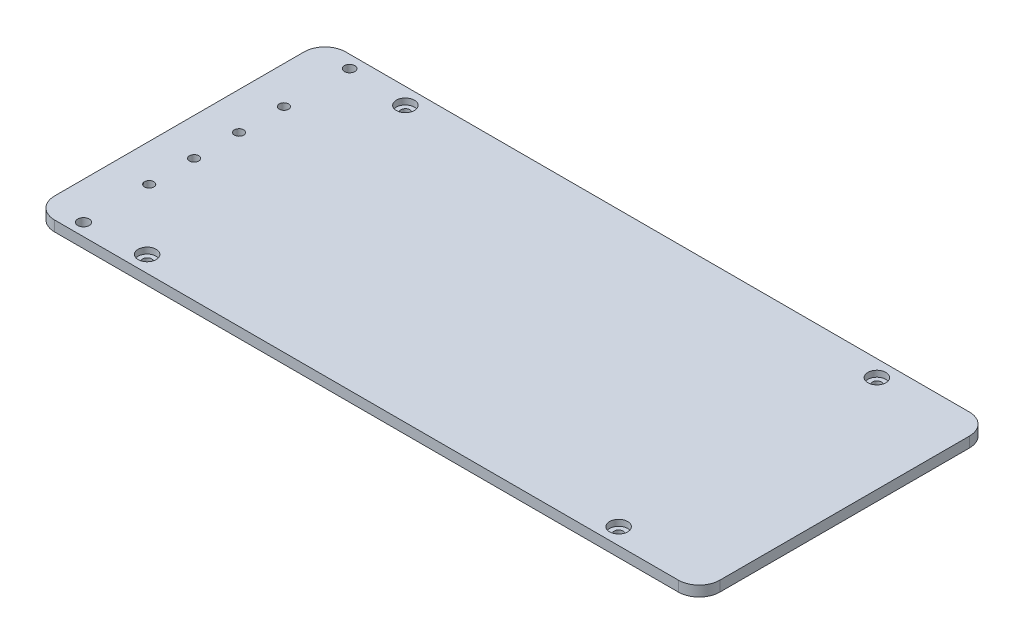
ISO-10303-21;
HEADER;
FILE_DESCRIPTION(('STEP AP214'),'2;1');
FILE_NAME('part.step','',(''),(''),'','','');
FILE_SCHEMA(('AUTOMOTIVE_DESIGN { 1 0 10303 214 1 1 1 1 }'));
ENDSEC;
DATA;
#1=APPLICATION_CONTEXT('core data for automotive mechanical design processes');
#2=APPLICATION_PROTOCOL_DEFINITION('international standard','automotive_design',2000,#1);
#3=PRODUCT_CONTEXT('',#1,'mechanical');
#4=PRODUCT('Part','Part','',(#3));
#5=PRODUCT_RELATED_PRODUCT_CATEGORY('part','',(#4));
#6=PRODUCT_DEFINITION_FORMATION('','',#4);
#7=PRODUCT_DEFINITION_CONTEXT('part definition',#1,'design');
#8=PRODUCT_DEFINITION('design','',#6,#7);
#9=PRODUCT_DEFINITION_SHAPE('','',#8);
#10=(LENGTH_UNIT() NAMED_UNIT(*) SI_UNIT(.MILLI.,.METRE.));
#11=(NAMED_UNIT(*) PLANE_ANGLE_UNIT() SI_UNIT($,.RADIAN.));
#12=(NAMED_UNIT(*) SI_UNIT($,.STERADIAN.) SOLID_ANGLE_UNIT());
#13=UNCERTAINTY_MEASURE_WITH_UNIT(LENGTH_MEASURE(1.E-05),#10,'distance_accuracy_value','');
#14=(GEOMETRIC_REPRESENTATION_CONTEXT(3) GLOBAL_UNCERTAINTY_ASSIGNED_CONTEXT((#13)) GLOBAL_UNIT_ASSIGNED_CONTEXT((#10,
#11,#12)) REPRESENTATION_CONTEXT('',''));
#15=CARTESIAN_POINT('',(0.,0.,0.));
#16=DIRECTION('',(0.,0.,1.));
#17=DIRECTION('',(1.,0.,0.));
#18=AXIS2_PLACEMENT_3D('',#15,#16,#17);
#19=CARTESIAN_POINT('',(-203.2,6.35,-88.9));
#20=DIRECTION('',(0.,0.,-1.));
#21=DIRECTION('',(-1.,0.,0.));
#22=AXIS2_PLACEMENT_3D('',#19,#20,#21);
#23=PLANE('',#22);
#24=DIRECTION('',(1.,0.,0.));
#25=VECTOR('',#24,1.);
#26=CARTESIAN_POINT('',(-203.2,0.,-88.9));
#27=LINE('',#26,#25);
#28=CARTESIAN_POINT('',(-190.5,0.,-88.9));
#29=VERTEX_POINT('',#28);
#30=CARTESIAN_POINT('',(190.5,0.,-88.9));
#31=VERTEX_POINT('',#30);
#32=EDGE_CURVE('E193',#29,#31,#27,.T.);
#33=ORIENTED_EDGE('',*,*,#32,.F.);
#34=DIRECTION('',(0.,-1.,0.));
#35=VECTOR('',#34,1.);
#36=CARTESIAN_POINT('',(-190.5,6.35,-88.9));
#37=LINE('',#36,#35);
#38=CARTESIAN_POINT('',(-190.5,6.35,-88.9));
#39=VERTEX_POINT('',#38);
#40=EDGE_CURVE('E118',#29,#39,#37,.F.);
#41=ORIENTED_EDGE('',*,*,#40,.T.);
#42=DIRECTION('',(1.,0.,0.));
#43=VECTOR('',#42,1.);
#44=CARTESIAN_POINT('',(-203.2,6.35,-88.9));
#45=LINE('',#44,#43);
#46=CARTESIAN_POINT('',(190.5,6.35,-88.9));
#47=VERTEX_POINT('',#46);
#48=EDGE_CURVE('E142',#39,#47,#45,.T.);
#49=ORIENTED_EDGE('',*,*,#48,.T.);
#50=DIRECTION('',(0.,-1.,0.));
#51=VECTOR('',#50,1.);
#52=CARTESIAN_POINT('',(190.5,6.35,-88.9));
#53=LINE('',#52,#51);
#54=EDGE_CURVE('E124',#47,#31,#53,.T.);
#55=ORIENTED_EDGE('',*,*,#54,.T.);
#56=EDGE_LOOP('',(#33,#41,#49,#55));
#57=FACE_BOUND('',#56,.T.);
#58=ADVANCED_FACE('F47',(#57),#23,.T.);
#59=CARTESIAN_POINT('',(-203.2,6.35,-88.9));
#60=DIRECTION('',(1.,0.,0.));
#61=DIRECTION('',(0.,0.,-1.));
#62=AXIS2_PLACEMENT_3D('',#59,#60,#61);
#63=PLANE('',#62);
#64=DIRECTION('',(0.,0.,1.));
#65=VECTOR('',#64,1.);
#66=CARTESIAN_POINT('',(-203.2,6.35,-88.9));
#67=LINE('',#66,#65);
#68=CARTESIAN_POINT('',(-203.2,6.35,-76.2));
#69=VERTEX_POINT('',#68);
#70=CARTESIAN_POINT('',(-203.2,6.35,76.2));
#71=VERTEX_POINT('',#70);
#72=EDGE_CURVE('E134',#69,#71,#67,.T.);
#73=ORIENTED_EDGE('',*,*,#72,.F.);
#74=DIRECTION('',(0.,-1.,0.));
#75=VECTOR('',#74,1.);
#76=CARTESIAN_POINT('',(-203.2,0.,-76.2));
#77=LINE('',#76,#75);
#78=CARTESIAN_POINT('',(-203.2,0.,-76.2));
#79=VERTEX_POINT('',#78);
#80=EDGE_CURVE('E117',#69,#79,#77,.T.);
#81=ORIENTED_EDGE('',*,*,#80,.T.);
#82=DIRECTION('',(0.,0.,1.));
#83=VECTOR('',#82,1.);
#84=CARTESIAN_POINT('',(-203.2,0.,-88.9));
#85=LINE('',#84,#83);
#86=CARTESIAN_POINT('',(-203.2,0.,76.2));
#87=VERTEX_POINT('',#86);
#88=EDGE_CURVE('E131',#79,#87,#85,.T.);
#89=ORIENTED_EDGE('',*,*,#88,.T.);
#90=DIRECTION('',(0.,-1.,0.));
#91=VECTOR('',#90,1.);
#92=CARTESIAN_POINT('',(-203.2,6.35,76.2));
#93=LINE('',#92,#91);
#94=EDGE_CURVE('E137',#87,#71,#93,.F.);
#95=ORIENTED_EDGE('',*,*,#94,.T.);
#96=EDGE_LOOP('',(#73,#81,#89,#95));
#97=FACE_BOUND('',#96,.T.);
#98=ADVANCED_FACE('F130',(#97),#63,.F.);
#99=CARTESIAN_POINT('',(-203.2,6.35,88.9));
#100=DIRECTION('',(0.,0.,-1.));
#101=DIRECTION('',(-1.,0.,0.));
#102=AXIS2_PLACEMENT_3D('',#99,#100,#101);
#103=PLANE('',#102);
#104=DIRECTION('',(1.,0.,0.));
#105=VECTOR('',#104,1.);
#106=CARTESIAN_POINT('',(-203.2,6.35,88.9));
#107=LINE('',#106,#105);
#108=CARTESIAN_POINT('',(-190.5,6.35,88.9));
#109=VERTEX_POINT('',#108);
#110=CARTESIAN_POINT('',(190.5,6.35,88.9));
#111=VERTEX_POINT('',#110);
#112=EDGE_CURVE('E200',#109,#111,#107,.T.);
#113=ORIENTED_EDGE('',*,*,#112,.F.);
#114=DIRECTION('',(0.,-1.,0.));
#115=VECTOR('',#114,1.);
#116=CARTESIAN_POINT('',(-190.5,6.35,88.9));
#117=LINE('',#116,#115);
#118=CARTESIAN_POINT('',(-190.5,0.,88.9));
#119=VERTEX_POINT('',#118);
#120=EDGE_CURVE('E183',#109,#119,#117,.T.);
#121=ORIENTED_EDGE('',*,*,#120,.T.);
#122=DIRECTION('',(1.,0.,0.));
#123=VECTOR('',#122,1.);
#124=CARTESIAN_POINT('',(-203.2,0.,88.9));
#125=LINE('',#124,#123);
#126=CARTESIAN_POINT('',(190.5,0.,88.9));
#127=VERTEX_POINT('',#126);
#128=EDGE_CURVE('E143',#119,#127,#125,.T.);
#129=ORIENTED_EDGE('',*,*,#128,.T.);
#130=DIRECTION('',(0.,-1.,0.));
#131=VECTOR('',#130,1.);
#132=CARTESIAN_POINT('',(190.5,6.35,88.9));
#133=LINE('',#132,#131);
#134=EDGE_CURVE('E180',#127,#111,#133,.F.);
#135=ORIENTED_EDGE('',*,*,#134,.T.);
#136=EDGE_LOOP('',(#113,#121,#129,#135));
#137=FACE_BOUND('',#136,.T.);
#138=ADVANCED_FACE('F367',(#137),#103,.F.);
#139=CARTESIAN_POINT('',(203.2,6.35,-88.9));
#140=DIRECTION('',(1.,0.,0.));
#141=DIRECTION('',(0.,0.,-1.));
#142=AXIS2_PLACEMENT_3D('',#139,#140,#141);
#143=PLANE('',#142);
#144=DIRECTION('',(0.,0.,1.));
#145=VECTOR('',#144,1.);
#146=CARTESIAN_POINT('',(203.2,0.,-88.9));
#147=LINE('',#146,#145);
#148=CARTESIAN_POINT('',(203.2,0.,-76.2));
#149=VERTEX_POINT('',#148);
#150=CARTESIAN_POINT('',(203.2,0.,76.2));
#151=VERTEX_POINT('',#150);
#152=EDGE_CURVE('E151',#149,#151,#147,.T.);
#153=ORIENTED_EDGE('',*,*,#152,.F.);
#154=DIRECTION('',(0.,-1.,0.));
#155=VECTOR('',#154,1.);
#156=CARTESIAN_POINT('',(203.2,6.35,-76.2));
#157=LINE('',#156,#155);
#158=CARTESIAN_POINT('',(203.2,6.35,-76.2));
#159=VERTEX_POINT('',#158);
#160=EDGE_CURVE('E11',#149,#159,#157,.F.);
#161=ORIENTED_EDGE('',*,*,#160,.T.);
#162=DIRECTION('',(0.,0.,1.));
#163=VECTOR('',#162,1.);
#164=CARTESIAN_POINT('',(203.2,6.35,-88.9));
#165=LINE('',#164,#163);
#166=CARTESIAN_POINT('',(203.2,6.35,76.2));
#167=VERTEX_POINT('',#166);
#168=EDGE_CURVE('E148',#159,#167,#165,.T.);
#169=ORIENTED_EDGE('',*,*,#168,.T.);
#170=DIRECTION('',(0.,-1.,0.));
#171=VECTOR('',#170,1.);
#172=CARTESIAN_POINT('',(203.2,0.,76.2));
#173=LINE('',#172,#171);
#174=EDGE_CURVE('E56',#167,#151,#173,.T.);
#175=ORIENTED_EDGE('',*,*,#174,.T.);
#176=EDGE_LOOP('',(#153,#161,#169,#175));
#177=FACE_BOUND('',#176,.T.);
#178=ADVANCED_FACE('F190',(#177),#143,.T.);
#179=CARTESIAN_POINT('',(0.,6.35,0.));
#180=DIRECTION('',(0.,-1.,0.));
#181=DIRECTION('',(0.,0.,-1.));
#182=AXIS2_PLACEMENT_3D('',#179,#180,#181);
#183=PLANE('',#182);
#184=CARTESIAN_POINT('',(-180.445833333333,6.35,-41.148));
#185=DIRECTION('',(0.,1.,0.));
#186=DIRECTION('',(0.,0.,1.));
#187=AXIS2_PLACEMENT_3D('',#184,#185,#186);
#188=CIRCLE('',#187,2.83640730371674);
#189=CARTESIAN_POINT('',(-180.445833333333,6.35,-38.3115926962832));
#190=VERTEX_POINT('',#189);
#191=EDGE_CURVE('E309',#190,#190,#188,.T.);
#192=ORIENTED_EDGE('',*,*,#191,.F.);
#193=EDGE_LOOP('',(#192));
#194=FACE_BOUND('',#193,.T.);
#195=CARTESIAN_POINT('',(-180.445833333333,6.35,-13.716));
#196=DIRECTION('',(0.,1.,0.));
#197=DIRECTION('',(0.,0.,1.));
#198=AXIS2_PLACEMENT_3D('',#195,#196,#197);
#199=CIRCLE('',#198,2.83640730371673);
#200=CARTESIAN_POINT('',(-180.445833333333,6.35,-10.8795926962832));
#201=VERTEX_POINT('',#200);
#202=EDGE_CURVE('E305',#201,#201,#199,.T.);
#203=ORIENTED_EDGE('',*,*,#202,.F.);
#204=EDGE_LOOP('',(#203));
#205=FACE_BOUND('',#204,.T.);
#206=CARTESIAN_POINT('',(-180.445833333333,6.35,13.716));
#207=DIRECTION('',(0.,1.,0.));
#208=DIRECTION('',(0.,0.,1.));
#209=AXIS2_PLACEMENT_3D('',#206,#207,#208);
#210=CIRCLE('',#209,2.83640730371673);
#211=CARTESIAN_POINT('',(-180.445833333333,6.35,16.5524073037168));
#212=VERTEX_POINT('',#211);
#213=EDGE_CURVE('E297',#212,#212,#210,.T.);
#214=ORIENTED_EDGE('',*,*,#213,.F.);
#215=EDGE_LOOP('',(#214));
#216=FACE_BOUND('',#215,.T.);
#217=CARTESIAN_POINT('',(-180.445833333333,6.35,41.148));
#218=DIRECTION('',(0.,1.,0.));
#219=DIRECTION('',(0.,0.,1.));
#220=AXIS2_PLACEMENT_3D('',#217,#218,#219);
#221=CIRCLE('',#220,2.83640730371673);
#222=CARTESIAN_POINT('',(-180.445833333333,6.35,43.9844073037168));
#223=VERTEX_POINT('',#222);
#224=EDGE_CURVE('E289',#223,#223,#221,.T.);
#225=ORIENTED_EDGE('',*,*,#224,.F.);
#226=EDGE_LOOP('',(#225));
#227=FACE_BOUND('',#226,.T.);
#228=CARTESIAN_POINT('',(-180.445833333333,6.35,-81.2799999999999));
#229=DIRECTION('',(0.,1.,0.));
#230=DIRECTION('',(0.,0.,1.));
#231=AXIS2_PLACEMENT_3D('',#228,#229,#230);
#232=CIRCLE('',#231,3.17500000000007);
#233=CARTESIAN_POINT('',(-180.445833333333,6.35,-78.1049999999998));
#234=VERTEX_POINT('',#233);
#235=EDGE_CURVE('E278',#234,#234,#232,.T.);
#236=ORIENTED_EDGE('',*,*,#235,.F.);
#237=EDGE_LOOP('',(#236));
#238=FACE_BOUND('',#237,.T.);
#239=CARTESIAN_POINT('',(-180.445833333333,6.35,81.2799999999999));
#240=DIRECTION('',(0.,1.,0.));
#241=DIRECTION('',(0.,0.,1.));
#242=AXIS2_PLACEMENT_3D('',#239,#240,#241);
#243=CIRCLE('',#242,3.49250000000001);
#244=CARTESIAN_POINT('',(-180.445833333333,6.35,84.7725));
#245=VERTEX_POINT('',#244);
#246=EDGE_CURVE('E273',#245,#245,#243,.T.);
#247=ORIENTED_EDGE('',*,*,#246,.F.);
#248=EDGE_LOOP('',(#247));
#249=FACE_BOUND('',#248,.T.);
#250=CARTESIAN_POINT('',(-143.999769965008,6.35,-78.8646190273989));
#251=DIRECTION('',(0.,1.,0.));
#252=DIRECTION('',(0.,0.,1.));
#253=AXIS2_PLACEMENT_3D('',#250,#251,#252);
#254=CIRCLE('',#253,5.50000000000001);
#255=CARTESIAN_POINT('',(-143.999769965008,6.35,-73.3646190273989));
#256=VERTEX_POINT('',#255);
#257=EDGE_CURVE('E264',#256,#256,#254,.T.);
#258=ORIENTED_EDGE('',*,*,#257,.F.);
#259=EDGE_LOOP('',(#258));
#260=FACE_BOUND('',#259,.T.);
#261=CARTESIAN_POINT('',(143.999769965008,6.35,-78.8646190273989));
#262=DIRECTION('',(0.,1.,0.));
#263=DIRECTION('',(0.,0.,1.));
#264=AXIS2_PLACEMENT_3D('',#261,#262,#263);
#265=CIRCLE('',#264,5.50000000000001);
#266=CARTESIAN_POINT('',(143.999769965008,6.35,-73.3646190273989));
#267=VERTEX_POINT('',#266);
#268=EDGE_CURVE('E248',#267,#267,#265,.T.);
#269=ORIENTED_EDGE('',*,*,#268,.F.);
#270=EDGE_LOOP('',(#269));
#271=FACE_BOUND('',#270,.T.);
#272=CARTESIAN_POINT('',(143.999769965008,6.35,78.8646190273989));
#273=DIRECTION('',(0.,1.,0.));
#274=DIRECTION('',(0.,0.,1.));
#275=AXIS2_PLACEMENT_3D('',#272,#273,#274);
#276=CIRCLE('',#275,5.50000000000001);
#277=CARTESIAN_POINT('',(143.999769965008,6.35,84.3646190273989));
#278=VERTEX_POINT('',#277);
#279=EDGE_CURVE('E232',#278,#278,#276,.T.);
#280=ORIENTED_EDGE('',*,*,#279,.F.);
#281=EDGE_LOOP('',(#280));
#282=FACE_BOUND('',#281,.T.);
#283=CARTESIAN_POINT('',(-143.999769965008,6.35,78.8646190273989));
#284=DIRECTION('',(0.,1.,0.));
#285=DIRECTION('',(0.,0.,1.));
#286=AXIS2_PLACEMENT_3D('',#283,#284,#285);
#287=CIRCLE('',#286,5.50000000000001);
#288=CARTESIAN_POINT('',(-143.999769965008,6.35,84.3646190273989));
#289=VERTEX_POINT('',#288);
#290=EDGE_CURVE('E216',#289,#289,#287,.T.);
#291=ORIENTED_EDGE('',*,*,#290,.F.);
#292=EDGE_LOOP('',(#291));
#293=FACE_BOUND('',#292,.T.);
#294=ORIENTED_EDGE('',*,*,#48,.F.);
#295=CARTESIAN_POINT('',(-190.5,6.35,-76.2));
#296=DIRECTION('',(0.,-1.,0.));
#297=DIRECTION('',(0.,0.,-1.));
#298=AXIS2_PLACEMENT_3D('',#295,#296,#297);
#299=CIRCLE('',#298,12.7);
#300=EDGE_CURVE('E177',#39,#69,#299,.F.);
#301=ORIENTED_EDGE('',*,*,#300,.T.);
#302=ORIENTED_EDGE('',*,*,#72,.T.);
#303=CARTESIAN_POINT('',(-190.5,6.35,76.2));
#304=DIRECTION('',(0.,-1.,0.));
#305=DIRECTION('',(0.,0.,-1.));
#306=AXIS2_PLACEMENT_3D('',#303,#304,#305);
#307=CIRCLE('',#306,12.7);
#308=EDGE_CURVE('E174',#71,#109,#307,.F.);
#309=ORIENTED_EDGE('',*,*,#308,.T.);
#310=ORIENTED_EDGE('',*,*,#112,.T.);
#311=CARTESIAN_POINT('',(190.5,6.35,76.2));
#312=DIRECTION('',(0.,-1.,0.));
#313=DIRECTION('',(0.,0.,-1.));
#314=AXIS2_PLACEMENT_3D('',#311,#312,#313);
#315=CIRCLE('',#314,12.7);
#316=EDGE_CURVE('E63',#111,#167,#315,.F.);
#317=ORIENTED_EDGE('',*,*,#316,.T.);
#318=ORIENTED_EDGE('',*,*,#168,.F.);
#319=CARTESIAN_POINT('',(190.5,6.35,-76.2));
#320=DIRECTION('',(0.,-1.,0.));
#321=DIRECTION('',(0.,0.,-1.));
#322=AXIS2_PLACEMENT_3D('',#319,#320,#321);
#323=CIRCLE('',#322,12.7);
#324=EDGE_CURVE('E171',#159,#47,#323,.F.);
#325=ORIENTED_EDGE('',*,*,#324,.T.);
#326=EDGE_LOOP('',(#294,#301,#302,#309,#310,#317,#318,#325));
#327=FACE_BOUND('',#326,.T.);
#328=ADVANCED_FACE('F326',(#194,#205,#216,#227,#238,#249,#260,#271,#282,#293,#327),#183,.F.);
#329=CARTESIAN_POINT('',(0.,0.,0.));
#330=DIRECTION('',(0.,-1.,0.));
#331=DIRECTION('',(0.,0.,-1.));
#332=AXIS2_PLACEMENT_3D('',#329,#330,#331);
#333=PLANE('',#332);
#334=CARTESIAN_POINT('',(-180.445833333333,0.,-41.148));
#335=DIRECTION('',(0.,1.,0.));
#336=DIRECTION('',(0.,0.,1.));
#337=AXIS2_PLACEMENT_3D('',#334,#335,#336);
#338=CIRCLE('',#337,2.83640730371674);
#339=CARTESIAN_POINT('',(-180.445833333333,0.,-38.3115926962832));
#340=VERTEX_POINT('',#339);
#341=EDGE_CURVE('E274',#340,#340,#338,.T.);
#342=ORIENTED_EDGE('',*,*,#341,.T.);
#343=EDGE_LOOP('',(#342));
#344=FACE_BOUND('',#343,.T.);
#345=CARTESIAN_POINT('',(-180.445833333333,0.,-13.716));
#346=DIRECTION('',(0.,1.,0.));
#347=DIRECTION('',(0.,0.,1.));
#348=AXIS2_PLACEMENT_3D('',#345,#346,#347);
#349=CIRCLE('',#348,2.83640730371673);
#350=CARTESIAN_POINT('',(-180.445833333333,0.,-10.8795926962832));
#351=VERTEX_POINT('',#350);
#352=EDGE_CURVE('E301',#351,#351,#349,.T.);
#353=ORIENTED_EDGE('',*,*,#352,.T.);
#354=EDGE_LOOP('',(#353));
#355=FACE_BOUND('',#354,.T.);
#356=CARTESIAN_POINT('',(-180.445833333333,0.,13.716));
#357=DIRECTION('',(0.,1.,0.));
#358=DIRECTION('',(0.,0.,1.));
#359=AXIS2_PLACEMENT_3D('',#356,#357,#358);
#360=CIRCLE('',#359,2.83640730371673);
#361=CARTESIAN_POINT('',(-180.445833333333,0.,16.5524073037168));
#362=VERTEX_POINT('',#361);
#363=EDGE_CURVE('E293',#362,#362,#360,.T.);
#364=ORIENTED_EDGE('',*,*,#363,.T.);
#365=EDGE_LOOP('',(#364));
#366=FACE_BOUND('',#365,.T.);
#367=CARTESIAN_POINT('',(-180.445833333333,0.,41.148));
#368=DIRECTION('',(0.,1.,0.));
#369=DIRECTION('',(0.,0.,1.));
#370=AXIS2_PLACEMENT_3D('',#367,#368,#369);
#371=CIRCLE('',#370,2.83640730371673);
#372=CARTESIAN_POINT('',(-180.445833333333,0.,43.9844073037168));
#373=VERTEX_POINT('',#372);
#374=EDGE_CURVE('E285',#373,#373,#371,.T.);
#375=ORIENTED_EDGE('',*,*,#374,.T.);
#376=EDGE_LOOP('',(#375));
#377=FACE_BOUND('',#376,.T.);
#378=CARTESIAN_POINT('',(-180.445833333333,0.,-81.2799999999999));
#379=DIRECTION('',(0.,1.,0.));
#380=DIRECTION('',(0.,0.,1.));
#381=AXIS2_PLACEMENT_3D('',#378,#379,#380);
#382=CIRCLE('',#381,3.17500000000007);
#383=CARTESIAN_POINT('',(-180.445833333333,0.,-78.1049999999998));
#384=VERTEX_POINT('',#383);
#385=EDGE_CURVE('E268',#384,#384,#382,.T.);
#386=ORIENTED_EDGE('',*,*,#385,.T.);
#387=EDGE_LOOP('',(#386));
#388=FACE_BOUND('',#387,.T.);
#389=CARTESIAN_POINT('',(-180.445833333333,0.,81.2799999999999));
#390=DIRECTION('',(0.,1.,0.));
#391=DIRECTION('',(0.,0.,1.));
#392=AXIS2_PLACEMENT_3D('',#389,#390,#391);
#393=CIRCLE('',#392,3.49250000000001);
#394=CARTESIAN_POINT('',(-180.445833333333,0.,84.7725));
#395=VERTEX_POINT('',#394);
#396=EDGE_CURVE('E269',#395,#395,#393,.T.);
#397=ORIENTED_EDGE('',*,*,#396,.T.);
#398=EDGE_LOOP('',(#397));
#399=FACE_BOUND('',#398,.T.);
#400=CARTESIAN_POINT('',(-143.999769965008,0.,-78.8646190273989));
#401=DIRECTION('',(0.,1.,0.));
#402=DIRECTION('',(0.,0.,1.));
#403=AXIS2_PLACEMENT_3D('',#400,#401,#402);
#404=CIRCLE('',#403,2.75);
#405=CARTESIAN_POINT('',(-143.999769965008,0.,-76.1146190273989));
#406=VERTEX_POINT('',#405);
#407=EDGE_CURVE('E252',#406,#406,#404,.T.);
#408=ORIENTED_EDGE('',*,*,#407,.T.);
#409=EDGE_LOOP('',(#408));
#410=FACE_BOUND('',#409,.T.);
#411=CARTESIAN_POINT('',(143.999769965008,0.,-78.8646190273989));
#412=DIRECTION('',(0.,1.,0.));
#413=DIRECTION('',(0.,0.,1.));
#414=AXIS2_PLACEMENT_3D('',#411,#412,#413);
#415=CIRCLE('',#414,2.75);
#416=CARTESIAN_POINT('',(143.999769965008,0.,-76.1146190273989));
#417=VERTEX_POINT('',#416);
#418=EDGE_CURVE('E236',#417,#417,#415,.T.);
#419=ORIENTED_EDGE('',*,*,#418,.T.);
#420=EDGE_LOOP('',(#419));
#421=FACE_BOUND('',#420,.T.);
#422=CARTESIAN_POINT('',(143.999769965008,0.,78.8646190273989));
#423=DIRECTION('',(0.,1.,0.));
#424=DIRECTION('',(0.,0.,1.));
#425=AXIS2_PLACEMENT_3D('',#422,#423,#424);
#426=CIRCLE('',#425,2.75);
#427=CARTESIAN_POINT('',(143.999769965008,0.,81.6146190273989));
#428=VERTEX_POINT('',#427);
#429=EDGE_CURVE('E220',#428,#428,#426,.T.);
#430=ORIENTED_EDGE('',*,*,#429,.T.);
#431=EDGE_LOOP('',(#430));
#432=FACE_BOUND('',#431,.T.);
#433=CARTESIAN_POINT('',(-143.999769965008,0.,78.8646190273989));
#434=DIRECTION('',(0.,1.,0.));
#435=DIRECTION('',(0.,0.,1.));
#436=AXIS2_PLACEMENT_3D('',#433,#434,#435);
#437=CIRCLE('',#436,2.75);
#438=CARTESIAN_POINT('',(-143.999769965008,0.,81.6146190273989));
#439=VERTEX_POINT('',#438);
#440=EDGE_CURVE('E195',#439,#439,#437,.T.);
#441=ORIENTED_EDGE('',*,*,#440,.T.);
#442=EDGE_LOOP('',(#441));
#443=FACE_BOUND('',#442,.T.);
#444=ORIENTED_EDGE('',*,*,#88,.F.);
#445=CARTESIAN_POINT('',(-190.5,0.,-76.2));
#446=DIRECTION('',(0.,-1.,0.));
#447=DIRECTION('',(0.,0.,-1.));
#448=AXIS2_PLACEMENT_3D('',#445,#446,#447);
#449=CIRCLE('',#448,12.7);
#450=EDGE_CURVE('E113',#79,#29,#449,.T.);
#451=ORIENTED_EDGE('',*,*,#450,.T.);
#452=ORIENTED_EDGE('',*,*,#32,.T.);
#453=CARTESIAN_POINT('',(190.5,0.,-76.2));
#454=DIRECTION('',(0.,-1.,0.));
#455=DIRECTION('',(0.,0.,-1.));
#456=AXIS2_PLACEMENT_3D('',#453,#454,#455);
#457=CIRCLE('',#456,12.7);
#458=EDGE_CURVE('E159',#31,#149,#457,.T.);
#459=ORIENTED_EDGE('',*,*,#458,.T.);
#460=ORIENTED_EDGE('',*,*,#152,.T.);
#461=CARTESIAN_POINT('',(190.5,0.,76.2));
#462=DIRECTION('',(0.,-1.,0.));
#463=DIRECTION('',(0.,0.,-1.));
#464=AXIS2_PLACEMENT_3D('',#461,#462,#463);
#465=CIRCLE('',#464,12.7);
#466=EDGE_CURVE('E136',#151,#127,#465,.T.);
#467=ORIENTED_EDGE('',*,*,#466,.T.);
#468=ORIENTED_EDGE('',*,*,#128,.F.);
#469=CARTESIAN_POINT('',(-190.5,0.,76.2));
#470=DIRECTION('',(0.,-1.,0.));
#471=DIRECTION('',(0.,0.,-1.));
#472=AXIS2_PLACEMENT_3D('',#469,#470,#471);
#473=CIRCLE('',#472,12.7);
#474=EDGE_CURVE('E125',#119,#87,#473,.T.);
#475=ORIENTED_EDGE('',*,*,#474,.T.);
#476=EDGE_LOOP('',(#444,#451,#452,#459,#460,#467,#468,#475));
#477=FACE_BOUND('',#476,.T.);
#478=ADVANCED_FACE('F139',(#344,#355,#366,#377,#388,#399,#410,#421,#432,#443,#477),#333,.T.);
#479=CARTESIAN_POINT('',(-190.5,6.35,-76.2));
#480=DIRECTION('',(0.,1.,0.));
#481=DIRECTION('',(0.,0.,1.));
#482=AXIS2_PLACEMENT_3D('',#479,#480,#481);
#483=CYLINDRICAL_SURFACE('',#482,12.7);
#484=ORIENTED_EDGE('',*,*,#300,.F.);
#485=ORIENTED_EDGE('',*,*,#40,.F.);
#486=ORIENTED_EDGE('',*,*,#450,.F.);
#487=ORIENTED_EDGE('',*,*,#80,.F.);
#488=EDGE_LOOP('',(#484,#485,#486,#487));
#489=FACE_BOUND('',#488,.T.);
#490=ADVANCED_FACE('F116',(#489),#483,.T.);
#491=CARTESIAN_POINT('',(-190.5,6.35,76.2));
#492=DIRECTION('',(0.,-1.,0.));
#493=DIRECTION('',(0.,0.,-1.));
#494=AXIS2_PLACEMENT_3D('',#491,#492,#493);
#495=CYLINDRICAL_SURFACE('',#494,12.7);
#496=ORIENTED_EDGE('',*,*,#308,.F.);
#497=ORIENTED_EDGE('',*,*,#94,.F.);
#498=ORIENTED_EDGE('',*,*,#474,.F.);
#499=ORIENTED_EDGE('',*,*,#120,.F.);
#500=EDGE_LOOP('',(#496,#497,#498,#499));
#501=FACE_BOUND('',#500,.T.);
#502=ADVANCED_FACE('F354',(#501),#495,.T.);
#503=CARTESIAN_POINT('',(190.5,6.35,-76.2));
#504=DIRECTION('',(0.,-1.,0.));
#505=DIRECTION('',(0.,0.,-1.));
#506=AXIS2_PLACEMENT_3D('',#503,#504,#505);
#507=CYLINDRICAL_SURFACE('',#506,12.7);
#508=ORIENTED_EDGE('',*,*,#324,.F.);
#509=ORIENTED_EDGE('',*,*,#160,.F.);
#510=ORIENTED_EDGE('',*,*,#458,.F.);
#511=ORIENTED_EDGE('',*,*,#54,.F.);
#512=EDGE_LOOP('',(#508,#509,#510,#511));
#513=FACE_BOUND('',#512,.T.);
#514=ADVANCED_FACE('F352',(#513),#507,.T.);
#515=CARTESIAN_POINT('',(190.5,6.35,76.2));
#516=DIRECTION('',(0.,1.,0.));
#517=DIRECTION('',(0.,0.,1.));
#518=AXIS2_PLACEMENT_3D('',#515,#516,#517);
#519=CYLINDRICAL_SURFACE('',#518,12.7);
#520=ORIENTED_EDGE('',*,*,#316,.F.);
#521=ORIENTED_EDGE('',*,*,#134,.F.);
#522=ORIENTED_EDGE('',*,*,#466,.F.);
#523=ORIENTED_EDGE('',*,*,#174,.F.);
#524=EDGE_LOOP('',(#520,#521,#522,#523));
#525=FACE_BOUND('',#524,.T.);
#526=ADVANCED_FACE('F49',(#525),#519,.T.);
#527=CARTESIAN_POINT('',(-143.999769965008,6.35,78.8646190273989));
#528=DIRECTION('',(0.,1.,0.));
#529=DIRECTION('',(0.,0.,1.));
#530=AXIS2_PLACEMENT_3D('',#527,#528,#529);
#531=CYLINDRICAL_SURFACE('',#530,2.75);
#532=ORIENTED_EDGE('',*,*,#440,.F.);
#533=EDGE_LOOP('',(#532));
#534=FACE_BOUND('',#533,.T.);
#535=CARTESIAN_POINT('',(-143.999769965008,2.65,78.8646190273989));
#536=DIRECTION('',(0.,1.,0.));
#537=DIRECTION('',(0.,0.,1.));
#538=AXIS2_PLACEMENT_3D('',#535,#536,#537);
#539=CIRCLE('',#538,2.75);
#540=CARTESIAN_POINT('',(-143.999769965008,2.65,81.6146190273989));
#541=VERTEX_POINT('',#540);
#542=EDGE_CURVE('E208',#541,#541,#539,.T.);
#543=ORIENTED_EDGE('',*,*,#542,.T.);
#544=EDGE_LOOP('',(#543));
#545=FACE_BOUND('',#544,.T.);
#546=ADVANCED_FACE('F359',(#534,#545),#531,.F.);
#547=CARTESIAN_POINT('',(-141.249769965008,2.65,78.8646190273989));
#548=DIRECTION('',(0.,-1.,0.));
#549=DIRECTION('',(0.,0.,-1.));
#550=AXIS2_PLACEMENT_3D('',#547,#548,#549);
#551=PLANE('',#550);
#552=ORIENTED_EDGE('',*,*,#542,.F.);
#553=EDGE_LOOP('',(#552));
#554=FACE_BOUND('',#553,.T.);
#555=CARTESIAN_POINT('',(-143.999769965008,2.65,78.8646190273989));
#556=DIRECTION('',(0.,1.,0.));
#557=DIRECTION('',(0.,0.,1.));
#558=AXIS2_PLACEMENT_3D('',#555,#556,#557);
#559=CIRCLE('',#558,5.50000000000001);
#560=CARTESIAN_POINT('',(-143.999769965008,2.65,84.3646190273989));
#561=VERTEX_POINT('',#560);
#562=EDGE_CURVE('E212',#561,#561,#559,.T.);
#563=ORIENTED_EDGE('',*,*,#562,.T.);
#564=EDGE_LOOP('',(#563));
#565=FACE_BOUND('',#564,.T.);
#566=ADVANCED_FACE('F437',(#554,#565),#551,.F.);
#567=CARTESIAN_POINT('',(-143.999769965008,6.35,78.8646190273989));
#568=DIRECTION('',(0.,1.,0.));
#569=DIRECTION('',(0.,0.,1.));
#570=AXIS2_PLACEMENT_3D('',#567,#568,#569);
#571=CYLINDRICAL_SURFACE('',#570,5.50000000000001);
#572=ORIENTED_EDGE('',*,*,#562,.F.);
#573=EDGE_LOOP('',(#572));
#574=FACE_BOUND('',#573,.T.);
#575=ORIENTED_EDGE('',*,*,#290,.T.);
#576=EDGE_LOOP('',(#575));
#577=FACE_BOUND('',#576,.T.);
#578=ADVANCED_FACE('F446',(#574,#577),#571,.F.);
#579=CARTESIAN_POINT('',(143.999769965008,6.35,78.8646190273989));
#580=DIRECTION('',(0.,1.,0.));
#581=DIRECTION('',(0.,0.,1.));
#582=AXIS2_PLACEMENT_3D('',#579,#580,#581);
#583=CYLINDRICAL_SURFACE('',#582,2.75);
#584=ORIENTED_EDGE('',*,*,#429,.F.);
#585=EDGE_LOOP('',(#584));
#586=FACE_BOUND('',#585,.T.);
#587=CARTESIAN_POINT('',(143.999769965008,2.65,78.8646190273989));
#588=DIRECTION('',(0.,1.,0.));
#589=DIRECTION('',(0.,0.,1.));
#590=AXIS2_PLACEMENT_3D('',#587,#588,#589);
#591=CIRCLE('',#590,2.75);
#592=CARTESIAN_POINT('',(143.999769965008,2.65,81.6146190273989));
#593=VERTEX_POINT('',#592);
#594=EDGE_CURVE('E224',#593,#593,#591,.T.);
#595=ORIENTED_EDGE('',*,*,#594,.T.);
#596=EDGE_LOOP('',(#595));
#597=FACE_BOUND('',#596,.T.);
#598=ADVANCED_FACE('F457',(#586,#597),#583,.F.);
#599=CARTESIAN_POINT('',(146.749769965008,2.65,78.8646190273989));
#600=DIRECTION('',(0.,-1.,0.));
#601=DIRECTION('',(0.,0.,-1.));
#602=AXIS2_PLACEMENT_3D('',#599,#600,#601);
#603=PLANE('',#602);
#604=ORIENTED_EDGE('',*,*,#594,.F.);
#605=EDGE_LOOP('',(#604));
#606=FACE_BOUND('',#605,.T.);
#607=CARTESIAN_POINT('',(143.999769965008,2.65,78.8646190273989));
#608=DIRECTION('',(0.,1.,0.));
#609=DIRECTION('',(0.,0.,1.));
#610=AXIS2_PLACEMENT_3D('',#607,#608,#609);
#611=CIRCLE('',#610,5.50000000000001);
#612=CARTESIAN_POINT('',(143.999769965008,2.65,84.3646190273989));
#613=VERTEX_POINT('',#612);
#614=EDGE_CURVE('E228',#613,#613,#611,.T.);
#615=ORIENTED_EDGE('',*,*,#614,.T.);
#616=EDGE_LOOP('',(#615));
#617=FACE_BOUND('',#616,.T.);
#618=ADVANCED_FACE('F467',(#606,#617),#603,.F.);
#619=CARTESIAN_POINT('',(143.999769965008,6.35,78.8646190273989));
#620=DIRECTION('',(0.,1.,0.));
#621=DIRECTION('',(0.,0.,1.));
#622=AXIS2_PLACEMENT_3D('',#619,#620,#621);
#623=CYLINDRICAL_SURFACE('',#622,5.50000000000001);
#624=ORIENTED_EDGE('',*,*,#614,.F.);
#625=EDGE_LOOP('',(#624));
#626=FACE_BOUND('',#625,.T.);
#627=ORIENTED_EDGE('',*,*,#279,.T.);
#628=EDGE_LOOP('',(#627));
#629=FACE_BOUND('',#628,.T.);
#630=ADVANCED_FACE('F477',(#626,#629),#623,.F.);
#631=CARTESIAN_POINT('',(143.999769965008,6.35,-78.8646190273989));
#632=DIRECTION('',(0.,1.,0.));
#633=DIRECTION('',(0.,0.,1.));
#634=AXIS2_PLACEMENT_3D('',#631,#632,#633);
#635=CYLINDRICAL_SURFACE('',#634,2.75);
#636=ORIENTED_EDGE('',*,*,#418,.F.);
#637=EDGE_LOOP('',(#636));
#638=FACE_BOUND('',#637,.T.);
#639=CARTESIAN_POINT('',(143.999769965008,2.65,-78.8646190273989));
#640=DIRECTION('',(0.,1.,0.));
#641=DIRECTION('',(0.,0.,1.));
#642=AXIS2_PLACEMENT_3D('',#639,#640,#641);
#643=CIRCLE('',#642,2.75);
#644=CARTESIAN_POINT('',(143.999769965008,2.65,-76.1146190273989));
#645=VERTEX_POINT('',#644);
#646=EDGE_CURVE('E240',#645,#645,#643,.T.);
#647=ORIENTED_EDGE('',*,*,#646,.T.);
#648=EDGE_LOOP('',(#647));
#649=FACE_BOUND('',#648,.T.);
#650=ADVANCED_FACE('F488',(#638,#649),#635,.F.);
#651=CARTESIAN_POINT('',(146.749769965008,2.65,-78.8646190273989));
#652=DIRECTION('',(0.,-1.,0.));
#653=DIRECTION('',(0.,0.,-1.));
#654=AXIS2_PLACEMENT_3D('',#651,#652,#653);
#655=PLANE('',#654);
#656=ORIENTED_EDGE('',*,*,#646,.F.);
#657=EDGE_LOOP('',(#656));
#658=FACE_BOUND('',#657,.T.);
#659=CARTESIAN_POINT('',(143.999769965008,2.65,-78.8646190273989));
#660=DIRECTION('',(0.,1.,0.));
#661=DIRECTION('',(0.,0.,1.));
#662=AXIS2_PLACEMENT_3D('',#659,#660,#661);
#663=CIRCLE('',#662,5.50000000000001);
#664=CARTESIAN_POINT('',(143.999769965008,2.65,-73.3646190273989));
#665=VERTEX_POINT('',#664);
#666=EDGE_CURVE('E244',#665,#665,#663,.T.);
#667=ORIENTED_EDGE('',*,*,#666,.T.);
#668=EDGE_LOOP('',(#667));
#669=FACE_BOUND('',#668,.T.);
#670=ADVANCED_FACE('F498',(#658,#669),#655,.F.);
#671=CARTESIAN_POINT('',(143.999769965008,6.35,-78.8646190273989));
#672=DIRECTION('',(0.,1.,0.));
#673=DIRECTION('',(0.,0.,1.));
#674=AXIS2_PLACEMENT_3D('',#671,#672,#673);
#675=CYLINDRICAL_SURFACE('',#674,5.50000000000001);
#676=ORIENTED_EDGE('',*,*,#666,.F.);
#677=EDGE_LOOP('',(#676));
#678=FACE_BOUND('',#677,.T.);
#679=ORIENTED_EDGE('',*,*,#268,.T.);
#680=EDGE_LOOP('',(#679));
#681=FACE_BOUND('',#680,.T.);
#682=ADVANCED_FACE('F508',(#678,#681),#675,.F.);
#683=CARTESIAN_POINT('',(-143.999769965008,6.35,-78.8646190273989));
#684=DIRECTION('',(0.,1.,0.));
#685=DIRECTION('',(0.,0.,1.));
#686=AXIS2_PLACEMENT_3D('',#683,#684,#685);
#687=CYLINDRICAL_SURFACE('',#686,2.75);
#688=ORIENTED_EDGE('',*,*,#407,.F.);
#689=EDGE_LOOP('',(#688));
#690=FACE_BOUND('',#689,.T.);
#691=CARTESIAN_POINT('',(-143.999769965008,2.65,-78.8646190273989));
#692=DIRECTION('',(0.,1.,0.));
#693=DIRECTION('',(0.,0.,1.));
#694=AXIS2_PLACEMENT_3D('',#691,#692,#693);
#695=CIRCLE('',#694,2.75);
#696=CARTESIAN_POINT('',(-143.999769965008,2.65,-76.1146190273989));
#697=VERTEX_POINT('',#696);
#698=EDGE_CURVE('E256',#697,#697,#695,.T.);
#699=ORIENTED_EDGE('',*,*,#698,.T.);
#700=EDGE_LOOP('',(#699));
#701=FACE_BOUND('',#700,.T.);
#702=ADVANCED_FACE('F519',(#690,#701),#687,.F.);
#703=CARTESIAN_POINT('',(-141.249769965008,2.65,-78.8646190273989));
#704=DIRECTION('',(0.,-1.,0.));
#705=DIRECTION('',(0.,0.,-1.));
#706=AXIS2_PLACEMENT_3D('',#703,#704,#705);
#707=PLANE('',#706);
#708=ORIENTED_EDGE('',*,*,#698,.F.);
#709=EDGE_LOOP('',(#708));
#710=FACE_BOUND('',#709,.T.);
#711=CARTESIAN_POINT('',(-143.999769965008,2.65,-78.8646190273989));
#712=DIRECTION('',(0.,1.,0.));
#713=DIRECTION('',(0.,0.,1.));
#714=AXIS2_PLACEMENT_3D('',#711,#712,#713);
#715=CIRCLE('',#714,5.50000000000001);
#716=CARTESIAN_POINT('',(-143.999769965008,2.65,-73.3646190273989));
#717=VERTEX_POINT('',#716);
#718=EDGE_CURVE('E260',#717,#717,#715,.T.);
#719=ORIENTED_EDGE('',*,*,#718,.T.);
#720=EDGE_LOOP('',(#719));
#721=FACE_BOUND('',#720,.T.);
#722=ADVANCED_FACE('F529',(#710,#721),#707,.F.);
#723=CARTESIAN_POINT('',(-143.999769965008,6.35,-78.8646190273989));
#724=DIRECTION('',(0.,1.,0.));
#725=DIRECTION('',(0.,0.,1.));
#726=AXIS2_PLACEMENT_3D('',#723,#724,#725);
#727=CYLINDRICAL_SURFACE('',#726,5.50000000000001);
#728=ORIENTED_EDGE('',*,*,#718,.F.);
#729=EDGE_LOOP('',(#728));
#730=FACE_BOUND('',#729,.T.);
#731=ORIENTED_EDGE('',*,*,#257,.T.);
#732=EDGE_LOOP('',(#731));
#733=FACE_BOUND('',#732,.T.);
#734=ADVANCED_FACE('F539',(#730,#733),#727,.F.);
#735=CARTESIAN_POINT('',(-180.445833333333,0.,81.2799999999999));
#736=DIRECTION('',(0.,1.,0.));
#737=DIRECTION('',(0.,0.,1.));
#738=AXIS2_PLACEMENT_3D('',#735,#736,#737);
#739=CYLINDRICAL_SURFACE('',#738,3.49250000000001);
#740=ORIENTED_EDGE('',*,*,#396,.F.);
#741=EDGE_LOOP('',(#740));
#742=FACE_BOUND('',#741,.T.);
#743=ORIENTED_EDGE('',*,*,#246,.T.);
#744=EDGE_LOOP('',(#743));
#745=FACE_BOUND('',#744,.T.);
#746=ADVANCED_FACE('F550',(#742,#745),#739,.F.);
#747=CARTESIAN_POINT('',(-180.445833333333,0.,-81.2799999999999));
#748=DIRECTION('',(0.,1.,0.));
#749=DIRECTION('',(0.,0.,1.));
#750=AXIS2_PLACEMENT_3D('',#747,#748,#749);
#751=CYLINDRICAL_SURFACE('',#750,3.17500000000007);
#752=ORIENTED_EDGE('',*,*,#385,.F.);
#753=EDGE_LOOP('',(#752));
#754=FACE_BOUND('',#753,.T.);
#755=ORIENTED_EDGE('',*,*,#235,.T.);
#756=EDGE_LOOP('',(#755));
#757=FACE_BOUND('',#756,.T.);
#758=ADVANCED_FACE('F560',(#754,#757),#751,.F.);
#759=CARTESIAN_POINT('',(-180.445833333333,0.,41.148));
#760=DIRECTION('',(0.,1.,0.));
#761=DIRECTION('',(0.,0.,1.));
#762=AXIS2_PLACEMENT_3D('',#759,#760,#761);
#763=CYLINDRICAL_SURFACE('',#762,2.83640730371673);
#764=ORIENTED_EDGE('',*,*,#374,.F.);
#765=EDGE_LOOP('',(#764));
#766=FACE_BOUND('',#765,.T.);
#767=ORIENTED_EDGE('',*,*,#224,.T.);
#768=EDGE_LOOP('',(#767));
#769=FACE_BOUND('',#768,.T.);
#770=ADVANCED_FACE('F569',(#766,#769),#763,.F.);
#771=CARTESIAN_POINT('',(-180.445833333333,0.,13.716));
#772=DIRECTION('',(0.,1.,0.));
#773=DIRECTION('',(0.,0.,1.));
#774=AXIS2_PLACEMENT_3D('',#771,#772,#773);
#775=CYLINDRICAL_SURFACE('',#774,2.83640730371673);
#776=ORIENTED_EDGE('',*,*,#363,.F.);
#777=EDGE_LOOP('',(#776));
#778=FACE_BOUND('',#777,.T.);
#779=ORIENTED_EDGE('',*,*,#213,.T.);
#780=EDGE_LOOP('',(#779));
#781=FACE_BOUND('',#780,.T.);
#782=ADVANCED_FACE('F578',(#778,#781),#775,.F.);
#783=CARTESIAN_POINT('',(-180.445833333333,0.,-13.716));
#784=DIRECTION('',(0.,1.,0.));
#785=DIRECTION('',(0.,0.,1.));
#786=AXIS2_PLACEMENT_3D('',#783,#784,#785);
#787=CYLINDRICAL_SURFACE('',#786,2.83640730371673);
#788=ORIENTED_EDGE('',*,*,#352,.F.);
#789=EDGE_LOOP('',(#788));
#790=FACE_BOUND('',#789,.T.);
#791=ORIENTED_EDGE('',*,*,#202,.T.);
#792=EDGE_LOOP('',(#791));
#793=FACE_BOUND('',#792,.T.);
#794=ADVANCED_FACE('F322',(#790,#793),#787,.F.);
#795=CARTESIAN_POINT('',(-180.445833333333,0.,-41.148));
#796=DIRECTION('',(0.,1.,0.));
#797=DIRECTION('',(0.,0.,1.));
#798=AXIS2_PLACEMENT_3D('',#795,#796,#797);
#799=CYLINDRICAL_SURFACE('',#798,2.83640730371674);
#800=ORIENTED_EDGE('',*,*,#341,.F.);
#801=EDGE_LOOP('',(#800));
#802=FACE_BOUND('',#801,.T.);
#803=ORIENTED_EDGE('',*,*,#191,.T.);
#804=EDGE_LOOP('',(#803));
#805=FACE_BOUND('',#804,.T.);
#806=ADVANCED_FACE('F319',(#802,#805),#799,.F.);
#807=CLOSED_SHELL('',(#58,#98,#138,#178,#328,#478,#490,#502,#514,#526,#546,#566,#578,#598,#618,
#630,#650,#670,#682,#702,#722,#734,#746,#758,#770,#782,#794,#806));
#808=MANIFOLD_SOLID_BREP('B2',#807);
#809=ADVANCED_BREP_SHAPE_REPRESENTATION('',(#18,#808),#14);
#810=SHAPE_DEFINITION_REPRESENTATION(#9,#809);
ENDSEC;
END-ISO-10303-21;
